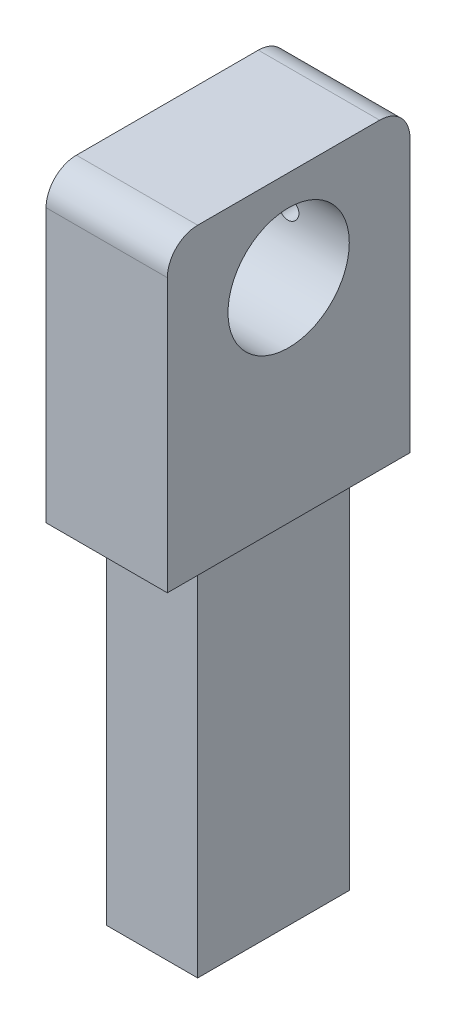
ISO-10303-21;
HEADER;
FILE_DESCRIPTION(('STEP AP214'),'2;1');
FILE_NAME('part.step','',(''),(''),'','','');
FILE_SCHEMA(('AUTOMOTIVE_DESIGN { 1 0 10303 214 1 1 1 1 }'));
ENDSEC;
DATA;
#1=APPLICATION_CONTEXT('core data for automotive mechanical design processes');
#2=APPLICATION_PROTOCOL_DEFINITION('international standard','automotive_design',2000,#1);
#3=PRODUCT_CONTEXT('',#1,'mechanical');
#4=PRODUCT('Part','Part','',(#3));
#5=PRODUCT_RELATED_PRODUCT_CATEGORY('part','',(#4));
#6=PRODUCT_DEFINITION_FORMATION('','',#4);
#7=PRODUCT_DEFINITION_CONTEXT('part definition',#1,'design');
#8=PRODUCT_DEFINITION('design','',#6,#7);
#9=PRODUCT_DEFINITION_SHAPE('','',#8);
#10=(LENGTH_UNIT() NAMED_UNIT(*) SI_UNIT(.MILLI.,.METRE.));
#11=(NAMED_UNIT(*) PLANE_ANGLE_UNIT() SI_UNIT($,.RADIAN.));
#12=(NAMED_UNIT(*) SI_UNIT($,.STERADIAN.) SOLID_ANGLE_UNIT());
#13=UNCERTAINTY_MEASURE_WITH_UNIT(LENGTH_MEASURE(1.E-05),#10,'distance_accuracy_value','');
#14=(GEOMETRIC_REPRESENTATION_CONTEXT(3) GLOBAL_UNCERTAINTY_ASSIGNED_CONTEXT((#13)) GLOBAL_UNIT_ASSIGNED_CONTEXT((#10,
#11,#12)) REPRESENTATION_CONTEXT('',''));
#15=CARTESIAN_POINT('',(0.,0.,0.));
#16=DIRECTION('',(0.,0.,1.));
#17=DIRECTION('',(1.,0.,0.));
#18=AXIS2_PLACEMENT_3D('',#15,#16,#17);
#19=CARTESIAN_POINT('',(9.525,76.2,15.875));
#20=DIRECTION('',(-1.,0.,0.));
#21=DIRECTION('',(0.,0.,1.));
#22=AXIS2_PLACEMENT_3D('',#19,#20,#21);
#23=PLANE('',#22);
#24=DIRECTION('',(0.,0.,-1.));
#25=VECTOR('',#24,1.);
#26=CARTESIAN_POINT('',(9.525,0.,15.875));
#27=LINE('',#26,#25);
#28=CARTESIAN_POINT('',(9.525,0.,15.875));
#29=VERTEX_POINT('',#28);
#30=CARTESIAN_POINT('',(9.525,0.,-15.875));
#31=VERTEX_POINT('',#30);
#32=EDGE_CURVE('E121',#29,#31,#27,.T.);
#33=ORIENTED_EDGE('',*,*,#32,.T.);
#34=DIRECTION('',(0.,-1.,0.));
#35=VECTOR('',#34,1.);
#36=CARTESIAN_POINT('',(9.525,76.2,-15.875));
#37=LINE('',#36,#35);
#38=CARTESIAN_POINT('',(9.525,76.2,-15.875));
#39=VERTEX_POINT('',#38);
#40=EDGE_CURVE('E182',#39,#31,#37,.T.);
#41=ORIENTED_EDGE('',*,*,#40,.F.);
#42=DIRECTION('',(0.,0.,-1.));
#43=VECTOR('',#42,1.);
#44=CARTESIAN_POINT('',(9.525,76.2,15.875));
#45=LINE('',#44,#43);
#46=CARTESIAN_POINT('',(9.525,76.2,15.875));
#47=VERTEX_POINT('',#46);
#48=EDGE_CURVE('E153',#47,#39,#45,.T.);
#49=ORIENTED_EDGE('',*,*,#48,.F.);
#50=DIRECTION('',(0.,-1.,0.));
#51=VECTOR('',#50,1.);
#52=CARTESIAN_POINT('',(9.525,76.2,15.875));
#53=LINE('',#52,#51);
#54=EDGE_CURVE('E166',#47,#29,#53,.T.);
#55=ORIENTED_EDGE('',*,*,#54,.T.);
#56=EDGE_LOOP('',(#33,#41,#49,#55));
#57=FACE_BOUND('',#56,.T.);
#58=ADVANCED_FACE('F39',(#57),#23,.F.);
#59=CARTESIAN_POINT('',(-9.525,76.2,-15.875));
#60=DIRECTION('',(0.,0.,1.));
#61=DIRECTION('',(1.,0.,0.));
#62=AXIS2_PLACEMENT_3D('',#59,#60,#61);
#63=PLANE('',#62);
#64=DIRECTION('',(-1.,0.,0.));
#65=VECTOR('',#64,1.);
#66=CARTESIAN_POINT('',(-9.525,0.,-15.875));
#67=LINE('',#66,#65);
#68=CARTESIAN_POINT('',(-9.525,0.,-15.875));
#69=VERTEX_POINT('',#68);
#70=EDGE_CURVE('E169',#31,#69,#67,.T.);
#71=ORIENTED_EDGE('',*,*,#70,.T.);
#72=DIRECTION('',(0.,-1.,0.));
#73=VECTOR('',#72,1.);
#74=CARTESIAN_POINT('',(-9.525,76.2,-15.875));
#75=LINE('',#74,#73);
#76=CARTESIAN_POINT('',(-9.525,76.2,-15.875));
#77=VERTEX_POINT('',#76);
#78=EDGE_CURVE('E179',#77,#69,#75,.T.);
#79=ORIENTED_EDGE('',*,*,#78,.F.);
#80=DIRECTION('',(-1.,0.,0.));
#81=VECTOR('',#80,1.);
#82=CARTESIAN_POINT('',(-9.525,76.2,-15.875));
#83=LINE('',#82,#81);
#84=EDGE_CURVE('E156',#39,#77,#83,.T.);
#85=ORIENTED_EDGE('',*,*,#84,.F.);
#86=ORIENTED_EDGE('',*,*,#40,.T.);
#87=EDGE_LOOP('',(#71,#79,#85,#86));
#88=FACE_BOUND('',#87,.T.);
#89=ADVANCED_FACE('F225',(#88),#63,.F.);
#90=CARTESIAN_POINT('',(-9.525,76.2,15.875));
#91=DIRECTION('',(1.,0.,0.));
#92=DIRECTION('',(0.,0.,-1.));
#93=AXIS2_PLACEMENT_3D('',#90,#91,#92);
#94=PLANE('',#93);
#95=DIRECTION('',(0.,0.,1.));
#96=VECTOR('',#95,1.);
#97=CARTESIAN_POINT('',(-9.525,0.,15.875));
#98=LINE('',#97,#96);
#99=CARTESIAN_POINT('',(-9.525,0.,15.875));
#100=VERTEX_POINT('',#99);
#101=EDGE_CURVE('E171',#69,#100,#98,.T.);
#102=ORIENTED_EDGE('',*,*,#101,.T.);
#103=DIRECTION('',(0.,-1.,0.));
#104=VECTOR('',#103,1.);
#105=CARTESIAN_POINT('',(-9.525,76.2,15.875));
#106=LINE('',#105,#104);
#107=CARTESIAN_POINT('',(-9.525,76.2,15.875));
#108=VERTEX_POINT('',#107);
#109=EDGE_CURVE('E176',#108,#100,#106,.T.);
#110=ORIENTED_EDGE('',*,*,#109,.F.);
#111=DIRECTION('',(0.,0.,1.));
#112=VECTOR('',#111,1.);
#113=CARTESIAN_POINT('',(-9.525,76.2,15.875));
#114=LINE('',#113,#112);
#115=EDGE_CURVE('E160',#77,#108,#114,.T.);
#116=ORIENTED_EDGE('',*,*,#115,.F.);
#117=ORIENTED_EDGE('',*,*,#78,.T.);
#118=EDGE_LOOP('',(#102,#110,#116,#117));
#119=FACE_BOUND('',#118,.T.);
#120=ADVANCED_FACE('F232',(#119),#94,.F.);
#121=CARTESIAN_POINT('',(-9.525,76.2,15.875));
#122=DIRECTION('',(0.,0.,-1.));
#123=DIRECTION('',(-1.,0.,0.));
#124=AXIS2_PLACEMENT_3D('',#121,#122,#123);
#125=PLANE('',#124);
#126=DIRECTION('',(1.,0.,0.));
#127=VECTOR('',#126,1.);
#128=CARTESIAN_POINT('',(-9.525,0.,15.875));
#129=LINE('',#128,#127);
#130=EDGE_CURVE('E157',#100,#29,#129,.T.);
#131=ORIENTED_EDGE('',*,*,#130,.T.);
#132=ORIENTED_EDGE('',*,*,#54,.F.);
#133=DIRECTION('',(1.,0.,0.));
#134=VECTOR('',#133,1.);
#135=CARTESIAN_POINT('',(-9.525,76.2,15.875));
#136=LINE('',#135,#134);
#137=EDGE_CURVE('E163',#108,#47,#136,.T.);
#138=ORIENTED_EDGE('',*,*,#137,.F.);
#139=ORIENTED_EDGE('',*,*,#109,.T.);
#140=EDGE_LOOP('',(#131,#132,#138,#139));
#141=FACE_BOUND('',#140,.T.);
#142=ADVANCED_FACE('F264',(#141),#125,.F.);
#143=CARTESIAN_POINT('',(0.,0.,0.));
#144=DIRECTION('',(0.,-1.,0.));
#145=DIRECTION('',(0.,0.,-1.));
#146=AXIS2_PLACEMENT_3D('',#143,#144,#145);
#147=PLANE('',#146);
#148=ORIENTED_EDGE('',*,*,#32,.F.);
#149=ORIENTED_EDGE('',*,*,#130,.F.);
#150=ORIENTED_EDGE('',*,*,#101,.F.);
#151=ORIENTED_EDGE('',*,*,#70,.F.);
#152=EDGE_LOOP('',(#148,#149,#150,#151));
#153=FACE_BOUND('',#152,.T.);
#154=ADVANCED_FACE('F258',(#153),#147,.T.);
#155=CARTESIAN_POINT('',(0.,76.2,0.));
#156=DIRECTION('',(0.,-1.,0.));
#157=DIRECTION('',(0.,0.,-1.));
#158=AXIS2_PLACEMENT_3D('',#155,#156,#157);
#159=PLANE('',#158);
#160=DIRECTION('',(0.,0.,-1.));
#161=VECTOR('',#160,1.);
#162=CARTESIAN_POINT('',(12.7,76.2,25.4));
#163=LINE('',#162,#161);
#164=CARTESIAN_POINT('',(12.7,76.2,25.4));
#165=VERTEX_POINT('',#164);
#166=CARTESIAN_POINT('',(12.7,76.2,-25.4));
#167=VERTEX_POINT('',#166);
#168=EDGE_CURVE('E129',#165,#167,#163,.T.);
#169=ORIENTED_EDGE('',*,*,#168,.F.);
#170=DIRECTION('',(1.,0.,0.));
#171=VECTOR('',#170,1.);
#172=CARTESIAN_POINT('',(-12.7,76.2,25.4));
#173=LINE('',#172,#171);
#174=CARTESIAN_POINT('',(-12.7,76.2,25.4));
#175=VERTEX_POINT('',#174);
#176=EDGE_CURVE('E146',#175,#165,#173,.T.);
#177=ORIENTED_EDGE('',*,*,#176,.F.);
#178=DIRECTION('',(0.,0.,1.));
#179=VECTOR('',#178,1.);
#180=CARTESIAN_POINT('',(-12.7,76.2,25.4));
#181=LINE('',#180,#179);
#182=CARTESIAN_POINT('',(-12.7,76.2,-25.4));
#183=VERTEX_POINT('',#182);
#184=EDGE_CURVE('E131',#183,#175,#181,.T.);
#185=ORIENTED_EDGE('',*,*,#184,.F.);
#186=DIRECTION('',(-1.,0.,0.));
#187=VECTOR('',#186,1.);
#188=CARTESIAN_POINT('',(-12.7,76.2,-25.4));
#189=LINE('',#188,#187);
#190=EDGE_CURVE('E117',#167,#183,#189,.T.);
#191=ORIENTED_EDGE('',*,*,#190,.F.);
#192=EDGE_LOOP('',(#169,#177,#185,#191));
#193=FACE_BOUND('',#192,.T.);
#194=ORIENTED_EDGE('',*,*,#48,.T.);
#195=ORIENTED_EDGE('',*,*,#84,.T.);
#196=ORIENTED_EDGE('',*,*,#115,.T.);
#197=ORIENTED_EDGE('',*,*,#137,.T.);
#198=EDGE_LOOP('',(#194,#195,#196,#197));
#199=FACE_BOUND('',#198,.T.);
#200=ADVANCED_FACE('F126',(#193,#199),#159,.T.);
#201=CARTESIAN_POINT('',(12.7,139.7,25.4));
#202=DIRECTION('',(-1.,0.,0.));
#203=DIRECTION('',(0.,0.,1.));
#204=AXIS2_PLACEMENT_3D('',#201,#202,#203);
#205=PLANE('',#204);
#206=CARTESIAN_POINT('',(12.7,120.65,0.));
#207=DIRECTION('',(1.,0.,0.));
#208=DIRECTION('',(0.,0.,-1.));
#209=AXIS2_PLACEMENT_3D('',#206,#207,#208);
#210=CIRCLE('',#209,12.7);
#211=CARTESIAN_POINT('',(12.7,120.65,-12.7));
#212=VERTEX_POINT('',#211);
#213=EDGE_CURVE('E139',#212,#212,#210,.T.);
#214=ORIENTED_EDGE('',*,*,#213,.F.);
#215=EDGE_LOOP('',(#214));
#216=FACE_BOUND('',#215,.T.);
#217=DIRECTION('',(0.,-1.,0.));
#218=VECTOR('',#217,1.);
#219=CARTESIAN_POINT('',(12.7,139.7,-25.4));
#220=LINE('',#219,#218);
#221=CARTESIAN_POINT('',(12.7,133.35,-25.4));
#222=VERTEX_POINT('',#221);
#223=EDGE_CURVE('E114',#222,#167,#220,.T.);
#224=ORIENTED_EDGE('',*,*,#223,.F.);
#225=CARTESIAN_POINT('',(12.7,133.35,-19.05));
#226=DIRECTION('',(-1.,0.,0.));
#227=DIRECTION('',(0.,0.,1.));
#228=AXIS2_PLACEMENT_3D('',#225,#226,#227);
#229=CIRCLE('',#228,6.35);
#230=CARTESIAN_POINT('',(12.7,139.7,-19.05));
#231=VERTEX_POINT('',#230);
#232=EDGE_CURVE('E47',#222,#231,#229,.F.);
#233=ORIENTED_EDGE('',*,*,#232,.T.);
#234=DIRECTION('',(0.,0.,-1.));
#235=VECTOR('',#234,1.);
#236=CARTESIAN_POINT('',(12.7,139.7,25.4));
#237=LINE('',#236,#235);
#238=CARTESIAN_POINT('',(12.7,139.7,19.05));
#239=VERTEX_POINT('',#238);
#240=EDGE_CURVE('E148',#239,#231,#237,.T.);
#241=ORIENTED_EDGE('',*,*,#240,.F.);
#242=CARTESIAN_POINT('',(12.7,133.35,19.05));
#243=DIRECTION('',(-1.,0.,0.));
#244=DIRECTION('',(0.,0.,1.));
#245=AXIS2_PLACEMENT_3D('',#242,#243,#244);
#246=CIRCLE('',#245,6.35);
#247=CARTESIAN_POINT('',(12.7,133.35,25.4));
#248=VERTEX_POINT('',#247);
#249=EDGE_CURVE('E54',#239,#248,#246,.F.);
#250=ORIENTED_EDGE('',*,*,#249,.T.);
#251=DIRECTION('',(0.,-1.,0.));
#252=VECTOR('',#251,1.);
#253=CARTESIAN_POINT('',(12.7,139.7,25.4));
#254=LINE('',#253,#252);
#255=EDGE_CURVE('E134',#248,#165,#254,.T.);
#256=ORIENTED_EDGE('',*,*,#255,.T.);
#257=ORIENTED_EDGE('',*,*,#168,.T.);
#258=EDGE_LOOP('',(#224,#233,#241,#250,#256,#257));
#259=FACE_BOUND('',#258,.T.);
#260=ADVANCED_FACE('F133',(#216,#259),#205,.F.);
#261=CARTESIAN_POINT('',(-12.7,139.7,-25.4));
#262=DIRECTION('',(0.,0.,1.));
#263=DIRECTION('',(1.,0.,0.));
#264=AXIS2_PLACEMENT_3D('',#261,#262,#263);
#265=PLANE('',#264);
#266=CARTESIAN_POINT('',(0.,120.65,-25.4));
#267=DIRECTION('',(0.,0.,-1.));
#268=DIRECTION('',(-1.,0.,0.));
#269=AXIS2_PLACEMENT_3D('',#266,#267,#268);
#270=CIRCLE('',#269,2.15265);
#271=CARTESIAN_POINT('',(-2.15265,120.65,-25.4));
#272=VERTEX_POINT('',#271);
#273=EDGE_CURVE('E326',#272,#272,#270,.T.);
#274=ORIENTED_EDGE('',*,*,#273,.F.);
#275=EDGE_LOOP('',(#274));
#276=FACE_BOUND('',#275,.T.);
#277=DIRECTION('',(0.,-1.,0.));
#278=VECTOR('',#277,1.);
#279=CARTESIAN_POINT('',(-12.7,139.7,-25.4));
#280=LINE('',#279,#278);
#281=CARTESIAN_POINT('',(-12.7,133.35,-25.4));
#282=VERTEX_POINT('',#281);
#283=EDGE_CURVE('E122',#282,#183,#280,.T.);
#284=ORIENTED_EDGE('',*,*,#283,.F.);
#285=DIRECTION('',(-1.,0.,0.));
#286=VECTOR('',#285,1.);
#287=CARTESIAN_POINT('',(-12.7,133.35,-25.4));
#288=LINE('',#287,#286);
#289=EDGE_CURVE('E62',#282,#222,#288,.F.);
#290=ORIENTED_EDGE('',*,*,#289,.T.);
#291=ORIENTED_EDGE('',*,*,#223,.T.);
#292=ORIENTED_EDGE('',*,*,#190,.T.);
#293=EDGE_LOOP('',(#284,#290,#291,#292));
#294=FACE_BOUND('',#293,.T.);
#295=ADVANCED_FACE('F116',(#276,#294),#265,.F.);
#296=CARTESIAN_POINT('',(-12.7,139.7,25.4));
#297=DIRECTION('',(1.,0.,0.));
#298=DIRECTION('',(0.,0.,-1.));
#299=AXIS2_PLACEMENT_3D('',#296,#297,#298);
#300=PLANE('',#299);
#301=CARTESIAN_POINT('',(-12.7,120.65,0.));
#302=DIRECTION('',(1.,0.,0.));
#303=DIRECTION('',(0.,0.,-1.));
#304=AXIS2_PLACEMENT_3D('',#301,#302,#303);
#305=CIRCLE('',#304,12.7);
#306=CARTESIAN_POINT('',(-12.7,120.65,-12.7));
#307=VERTEX_POINT('',#306);
#308=EDGE_CURVE('E136',#307,#307,#305,.T.);
#309=ORIENTED_EDGE('',*,*,#308,.T.);
#310=EDGE_LOOP('',(#309));
#311=FACE_BOUND('',#310,.T.);
#312=DIRECTION('',(0.,0.,1.));
#313=VECTOR('',#312,1.);
#314=CARTESIAN_POINT('',(-12.7,139.7,25.4));
#315=LINE('',#314,#313);
#316=CARTESIAN_POINT('',(-12.7,139.7,-19.05));
#317=VERTEX_POINT('',#316);
#318=CARTESIAN_POINT('',(-12.7,139.7,19.05));
#319=VERTEX_POINT('',#318);
#320=EDGE_CURVE('E142',#317,#319,#315,.T.);
#321=ORIENTED_EDGE('',*,*,#320,.F.);
#322=CARTESIAN_POINT('',(-12.7,133.35,-19.05));
#323=DIRECTION('',(1.,0.,0.));
#324=DIRECTION('',(0.,0.,-1.));
#325=AXIS2_PLACEMENT_3D('',#322,#323,#324);
#326=CIRCLE('',#325,6.35);
#327=EDGE_CURVE('E193',#317,#282,#326,.F.);
#328=ORIENTED_EDGE('',*,*,#327,.T.);
#329=ORIENTED_EDGE('',*,*,#283,.T.);
#330=ORIENTED_EDGE('',*,*,#184,.T.);
#331=DIRECTION('',(0.,-1.,0.));
#332=VECTOR('',#331,1.);
#333=CARTESIAN_POINT('',(-12.7,139.7,25.4));
#334=LINE('',#333,#332);
#335=CARTESIAN_POINT('',(-12.7,133.35,25.4));
#336=VERTEX_POINT('',#335);
#337=EDGE_CURVE('E150',#336,#175,#334,.T.);
#338=ORIENTED_EDGE('',*,*,#337,.F.);
#339=CARTESIAN_POINT('',(-12.7,133.35,19.05));
#340=DIRECTION('',(1.,0.,0.));
#341=DIRECTION('',(0.,0.,-1.));
#342=AXIS2_PLACEMENT_3D('',#339,#340,#341);
#343=CIRCLE('',#342,6.35);
#344=EDGE_CURVE('E191',#336,#319,#343,.F.);
#345=ORIENTED_EDGE('',*,*,#344,.T.);
#346=EDGE_LOOP('',(#321,#328,#329,#330,#338,#345));
#347=FACE_BOUND('',#346,.T.);
#348=ADVANCED_FACE('F206',(#311,#347),#300,.F.);
#349=CARTESIAN_POINT('',(-12.7,139.7,25.4));
#350=DIRECTION('',(0.,0.,-1.));
#351=DIRECTION('',(-1.,0.,0.));
#352=AXIS2_PLACEMENT_3D('',#349,#350,#351);
#353=PLANE('',#352);
#354=ORIENTED_EDGE('',*,*,#255,.F.);
#355=DIRECTION('',(1.,0.,0.));
#356=VECTOR('',#355,1.);
#357=CARTESIAN_POINT('',(-12.7,133.35,25.4));
#358=LINE('',#357,#356);
#359=EDGE_CURVE('E11',#248,#336,#358,.F.);
#360=ORIENTED_EDGE('',*,*,#359,.T.);
#361=ORIENTED_EDGE('',*,*,#337,.T.);
#362=ORIENTED_EDGE('',*,*,#176,.T.);
#363=EDGE_LOOP('',(#354,#360,#361,#362));
#364=FACE_BOUND('',#363,.T.);
#365=ADVANCED_FACE('F212',(#364),#353,.F.);
#366=CARTESIAN_POINT('',(0.,139.7,0.));
#367=DIRECTION('',(0.,-1.,0.));
#368=DIRECTION('',(0.,0.,-1.));
#369=AXIS2_PLACEMENT_3D('',#366,#367,#368);
#370=PLANE('',#369);
#371=ORIENTED_EDGE('',*,*,#240,.T.);
#372=DIRECTION('',(-1.,0.,0.));
#373=VECTOR('',#372,1.);
#374=CARTESIAN_POINT('',(0.,139.7,-19.05));
#375=LINE('',#374,#373);
#376=EDGE_CURVE('E188',#231,#317,#375,.T.);
#377=ORIENTED_EDGE('',*,*,#376,.T.);
#378=ORIENTED_EDGE('',*,*,#320,.T.);
#379=DIRECTION('',(1.,0.,0.));
#380=VECTOR('',#379,1.);
#381=CARTESIAN_POINT('',(0.,139.7,19.05));
#382=LINE('',#381,#380);
#383=EDGE_CURVE('E185',#319,#239,#382,.T.);
#384=ORIENTED_EDGE('',*,*,#383,.T.);
#385=EDGE_LOOP('',(#371,#377,#378,#384));
#386=FACE_BOUND('',#385,.T.);
#387=ADVANCED_FACE('F200',(#386),#370,.F.);
#388=CARTESIAN_POINT('',(0.,133.35,-19.05));
#389=DIRECTION('',(-1.,0.,0.));
#390=DIRECTION('',(0.,0.,1.));
#391=AXIS2_PLACEMENT_3D('',#388,#389,#390);
#392=CYLINDRICAL_SURFACE('',#391,6.35);
#393=ORIENTED_EDGE('',*,*,#232,.F.);
#394=ORIENTED_EDGE('',*,*,#289,.F.);
#395=ORIENTED_EDGE('',*,*,#327,.F.);
#396=ORIENTED_EDGE('',*,*,#376,.F.);
#397=EDGE_LOOP('',(#393,#394,#395,#396));
#398=FACE_BOUND('',#397,.T.);
#399=ADVANCED_FACE('F204',(#398),#392,.T.);
#400=CARTESIAN_POINT('',(0.,133.35,19.05));
#401=DIRECTION('',(1.,0.,0.));
#402=DIRECTION('',(0.,0.,-1.));
#403=AXIS2_PLACEMENT_3D('',#400,#401,#402);
#404=CYLINDRICAL_SURFACE('',#403,6.35);
#405=ORIENTED_EDGE('',*,*,#344,.F.);
#406=ORIENTED_EDGE('',*,*,#359,.F.);
#407=ORIENTED_EDGE('',*,*,#249,.F.);
#408=ORIENTED_EDGE('',*,*,#383,.F.);
#409=EDGE_LOOP('',(#405,#406,#407,#408));
#410=FACE_BOUND('',#409,.T.);
#411=ADVANCED_FACE('F41',(#410),#404,.T.);
#412=CARTESIAN_POINT('',(-12.7,120.65,0.));
#413=DIRECTION('',(1.,0.,0.));
#414=DIRECTION('',(0.,0.,-1.));
#415=AXIS2_PLACEMENT_3D('',#412,#413,#414);
#416=CYLINDRICAL_SURFACE('',#415,12.7);
#417=CARTESIAN_POINT('',(-2.15265,120.65,-12.7));
#418=CARTESIAN_POINT('',(-2.15264521569791,120.530006298646,-12.699997924655));
#419=CARTESIAN_POINT('',(-2.1425830149563,120.409947860943,-12.6982816971202));
#420=CARTESIAN_POINT('',(-2.10261799133396,120.173200311392,-12.6916006090816));
#421=CARTESIAN_POINT('',(-2.07269711763207,120.056514365809,-12.6866327930575));
#422=CARTESIAN_POINT('',(-1.99394582791418,119.829971127921,-12.6740055416238));
#423=CARTESIAN_POINT('',(-1.94513108992905,119.720108261343,-12.6663483383404));
#424=CARTESIAN_POINT('',(-1.83001925322609,119.510145866349,-12.6491834953183));
#425=CARTESIAN_POINT('',(-1.76372407761835,119.410045265596,-12.6396760591631));
#426=CARTESIAN_POINT('',(-1.61483711826864,119.221447017152,-12.6197591583024));
#427=CARTESIAN_POINT('',(-1.53210647721695,119.133059740743,-12.6093424637949));
#428=CARTESIAN_POINT('',(-1.35299586734683,118.971350712469,-12.5888361898486));
#429=CARTESIAN_POINT('',(-1.25661502289999,118.898029927826,-12.578746631446));
#430=CARTESIAN_POINT('',(-1.05217888262665,118.76809069061,-12.5599669596967));
#431=CARTESIAN_POINT('',(-0.944053024652442,118.711581787232,-12.5512861858316));
#432=CARTESIAN_POINT('',(-0.719671953405707,118.617571037699,-12.5364074652641));
#433=CARTESIAN_POINT('',(-0.603417309278593,118.580067862351,-12.5302093449403));
#434=CARTESIAN_POINT('',(-0.36725014008277,118.525481740197,-12.521069779767));
#435=CARTESIAN_POINT('',(-0.247382915742406,118.50820798814,-12.5180979243859));
#436=CARTESIAN_POINT('',(-0.00641741593518925,118.493979372627,-12.5156554210272));
#437=CARTESIAN_POINT('',(0.114680768777181,118.497023021934,-12.5161845167791));
#438=CARTESIAN_POINT('',(0.35330598106701,118.523187484942,-12.5206563793401));
#439=CARTESIAN_POINT('',(0.470857331366284,118.546093619107,-12.5245626433926));
#440=CARTESIAN_POINT('',(0.700423922620427,118.610995771892,-12.5352915403332));
#441=CARTESIAN_POINT('',(0.812438967617116,118.652992465689,-12.5421142763678));
#442=CARTESIAN_POINT('',(1.02839404990791,118.75510025756,-12.5579466335029));
#443=CARTESIAN_POINT('',(1.13229127304949,118.815300182156,-12.5669669351715));
#444=CARTESIAN_POINT('',(1.32859082454557,118.952042547154,-12.5861706944476));
#445=CARTESIAN_POINT('',(1.42099219305693,119.028586350737,-12.5963542490445));
#446=CARTESIAN_POINT('',(1.59291947260541,119.197011776318,-12.6168973037264));
#447=CARTESIAN_POINT('',(1.67226505514618,119.289077518077,-12.6272573853007));
#448=CARTESIAN_POINT('',(1.81440923333887,119.485311566517,-12.6468655373414));
#449=CARTESIAN_POINT('',(1.87720771548087,119.589479956213,-12.6561136001792));
#450=CARTESIAN_POINT('',(1.98449278841322,119.807134292884,-12.6724695158738));
#451=CARTESIAN_POINT('',(2.02896308417802,119.920628424047,-12.6795754627405));
#452=CARTESIAN_POINT('',(2.09816015761148,120.153622075608,-12.6908312775343));
#453=CARTESIAN_POINT('',(2.12288864428317,120.273121075228,-12.6949814013367));
#454=CARTESIAN_POINT('',(2.15165484616626,120.513178431699,-12.6998234607268));
#455=CARTESIAN_POINT('',(2.1559400528431,120.633706326102,-12.7005567587157));
#456=CARTESIAN_POINT('',(2.14435839886969,120.8737576859,-12.6985959571487));
#457=CARTESIAN_POINT('',(2.12849234113981,120.993281191124,-12.6959019941509));
#458=CARTESIAN_POINT('',(2.07726438091067,121.227163824306,-12.6874149953279));
#459=CARTESIAN_POINT('',(2.04202535697163,121.341550637048,-12.6816414991218));
#460=CARTESIAN_POINT('',(1.95318301945154,121.562792879538,-12.6676401846811));
#461=CARTESIAN_POINT('',(1.89957864545212,121.669647873969,-12.659412224729));
#462=CARTESIAN_POINT('',(1.77496287994788,121.873865854442,-12.6413120190352));
#463=CARTESIAN_POINT('',(1.70379732659813,121.971133477432,-12.6314254737356));
#464=CARTESIAN_POINT('',(1.54629094516507,122.152434179993,-12.6111470118822));
#465=CARTESIAN_POINT('',(1.45994897458953,122.236466262277,-12.6007550573234));
#466=CARTESIAN_POINT('',(1.27342929706948,122.389830918727,-12.5805028160375));
#467=CARTESIAN_POINT('',(1.17311304349881,122.458996051027,-12.57064943245));
#468=CARTESIAN_POINT('',(0.962140427344523,122.579493042892,-12.5527201526261));
#469=CARTESIAN_POINT('',(0.851484400725226,122.630825481629,-12.5446441986652));
#470=CARTESIAN_POINT('',(0.623435947736227,122.713951191478,-12.5312362762397));
#471=CARTESIAN_POINT('',(0.506074299801619,122.745826950014,-12.5258927394491));
#472=CARTESIAN_POINT('',(0.267564172942973,122.78939342253,-12.5185259687774));
#473=CARTESIAN_POINT('',(0.146416036671309,122.801085957607,-12.5165024353392));
#474=CARTESIAN_POINT('',(-0.0945554571032056,122.803901961008,-12.5160179945158));
#475=CARTESIAN_POINT('',(-0.214375723377884,122.795289056344,-12.5175114258408));
#476=CARTESIAN_POINT('',(-0.450835696296917,122.758309638542,-12.5237924174687));
#477=CARTESIAN_POINT('',(-0.567475414280441,122.729943195837,-12.5285799660259));
#478=CARTESIAN_POINT('',(-0.79415619503027,122.654364269091,-12.5408921577297));
#479=CARTESIAN_POINT('',(-0.9042052763161,122.607175244328,-12.54841339275));
#480=CARTESIAN_POINT('',(-1.11486715754801,122.495317963694,-12.5653486794714));
#481=CARTESIAN_POINT('',(-1.21547946286594,122.430648792291,-12.5747628303085));
#482=CARTESIAN_POINT('',(-1.40574225667553,122.284729213607,-12.5945675841662));
#483=CARTESIAN_POINT('',(-1.4952431219012,122.203285119387,-12.604968749501));
#484=CARTESIAN_POINT('',(-1.65939778245155,122.02653549881,-12.6254920298366));
#485=CARTESIAN_POINT('',(-1.73404814984292,121.931226780859,-12.6356140799461));
#486=CARTESIAN_POINT('',(-1.86687336471781,121.72864040438,-12.6545228762308));
#487=CARTESIAN_POINT('',(-1.92492628429852,121.621281851993,-12.6632995312268));
#488=CARTESIAN_POINT('',(-2.02208350885933,121.39823023787,-12.6784304467392));
#489=CARTESIAN_POINT('',(-2.06120654791025,121.282545546969,-12.6847871008901));
#490=CARTESIAN_POINT('',(-2.11097207888548,121.080353999692,-12.6929863246093));
#491=CARTESIAN_POINT('',(-2.12657605493461,120.99506533139,-12.6956022929582));
#492=CARTESIAN_POINT('',(-2.14741664800654,120.823195669668,-12.6991098640049));
#493=CARTESIAN_POINT('',(-2.15265345343867,120.736614699763,-12.7000014980402));
#494=CARTESIAN_POINT('',(-2.15265,120.65,-12.7));
#495=B_SPLINE_CURVE_WITH_KNOTS('',3,(#417,#418,#419,#420,#421,#422,#423,#424,#425,#426,#427,
#428,#429,#430,#431,#432,#433,#434,#435,#436,#437,#438,#439,#440,#441,#442,#443,#444,#445,#446,
#447,#448,#449,#450,#451,#452,#453,#454,#455,#456,#457,#458,#459,#460,#461,#462,#463,#464,#465,
#466,#467,#468,#469,#470,#471,#472,#473,#474,#475,#476,#477,#478,#479,#480,#481,#482,#483,#484,
#485,#486,#487,#488,#489,#490,#491,#492,#493,#494),.UNSPECIFIED.,.T.,.F.,(4,2,2,2,2,2,2,2,2,2,2,
2,2,2,2,2,2,2,2,2,2,2,2,2,2,2,2,2,2,2,2,2,2,2,2,2,2,2,4),(0.,0.359664482712598,
0.719656336084686,1.07935010829272,1.43900432529436,1.8018373141574,2.16469358845302,
2.52986496472286,2.89501079869204,3.25668408340223,3.61833089384127,3.97611696360601,
4.33391568819509,4.69348934236995,5.05309299892565,5.41730863180249,5.78152676306329,
6.14606801452232,6.51057770506052,6.87066315559292,7.23073425909154,7.5885474265767,
7.94638125773659,8.30747566629145,8.66859726995953,9.03359461183655,9.3985800981856,
9.76200726623957,10.125401641199,10.4841040724102,10.842805224622,11.2010607043238,
11.5593349514874,11.9220045380721,12.2847577426139,12.6501110757777,13.0151020914752,
13.2747223632014,13.5343379166365),.UNSPECIFIED.);
#496=CARTESIAN_POINT('',(-2.15265,120.65,-12.7));
#497=VERTEX_POINT('',#496);
#498=EDGE_CURVE('E328',#497,#497,#495,.T.);
#499=ORIENTED_EDGE('',*,*,#498,.F.);
#500=EDGE_LOOP('',(#499));
#501=FACE_BOUND('',#500,.T.);
#502=ORIENTED_EDGE('',*,*,#308,.F.);
#503=EDGE_LOOP('',(#502));
#504=FACE_BOUND('',#503,.T.);
#505=ORIENTED_EDGE('',*,*,#213,.T.);
#506=EDGE_LOOP('',(#505));
#507=FACE_BOUND('',#506,.T.);
#508=ADVANCED_FACE('F240',(#501,#504,#507),#416,.F.);
#509=CARTESIAN_POINT('',(0.,120.65,25.401));
#510=DIRECTION('',(0.,0.,-1.));
#511=DIRECTION('',(-1.,0.,0.));
#512=AXIS2_PLACEMENT_3D('',#509,#510,#511);
#513=CYLINDRICAL_SURFACE('',#512,2.15265);
#514=ORIENTED_EDGE('',*,*,#498,.T.);
#515=EDGE_LOOP('',(#514));
#516=FACE_BOUND('',#515,.T.);
#517=ORIENTED_EDGE('',*,*,#273,.T.);
#518=EDGE_LOOP('',(#517));
#519=FACE_BOUND('',#518,.T.);
#520=ADVANCED_FACE('F245',(#516,#519),#513,.F.);
#521=CLOSED_SHELL('',(#58,#89,#120,#142,#154,#200,#260,#295,#348,#365,#387,#399,#411,#508,#520));
#522=MANIFOLD_SOLID_BREP('B2',#521);
#523=ADVANCED_BREP_SHAPE_REPRESENTATION('',(#18,#522),#14);
#524=SHAPE_DEFINITION_REPRESENTATION(#9,#523);
ENDSEC;
END-ISO-10303-21;
